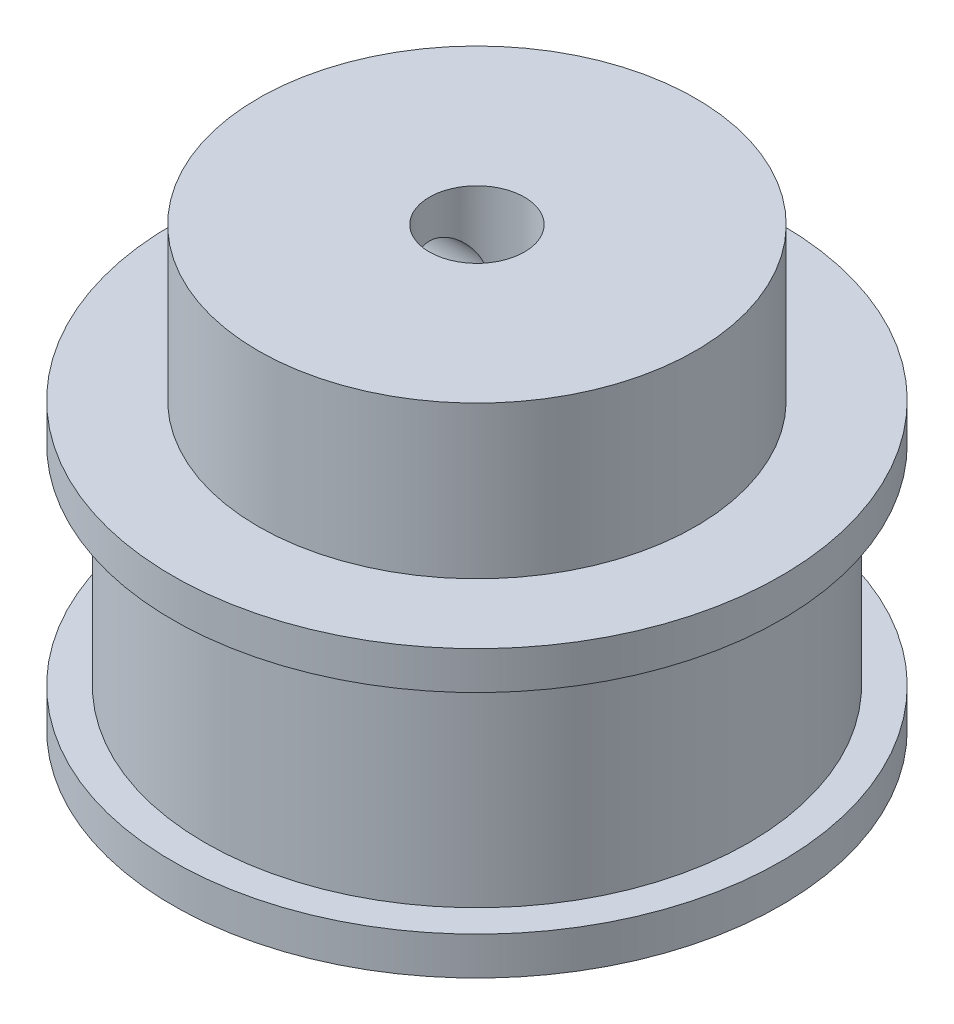
ISO-10303-21;
HEADER;
FILE_DESCRIPTION(('STEP AP214'),'2;1');
FILE_NAME('part.step','',(''),(''),'','','');
FILE_SCHEMA(('AUTOMOTIVE_DESIGN { 1 0 10303 214 1 1 1 1 }'));
ENDSEC;
DATA;
#1=APPLICATION_CONTEXT('core data for automotive mechanical design processes');
#2=APPLICATION_PROTOCOL_DEFINITION('international standard','automotive_design',2000,#1);
#3=PRODUCT_CONTEXT('',#1,'mechanical');
#4=PRODUCT('Part','Part','',(#3));
#5=PRODUCT_RELATED_PRODUCT_CATEGORY('part','',(#4));
#6=PRODUCT_DEFINITION_FORMATION('','',#4);
#7=PRODUCT_DEFINITION_CONTEXT('part definition',#1,'design');
#8=PRODUCT_DEFINITION('design','',#6,#7);
#9=PRODUCT_DEFINITION_SHAPE('','',#8);
#10=(LENGTH_UNIT() NAMED_UNIT(*) SI_UNIT(.MILLI.,.METRE.));
#11=(NAMED_UNIT(*) PLANE_ANGLE_UNIT() SI_UNIT($,.RADIAN.));
#12=(NAMED_UNIT(*) SI_UNIT($,.STERADIAN.) SOLID_ANGLE_UNIT());
#13=UNCERTAINTY_MEASURE_WITH_UNIT(LENGTH_MEASURE(1.E-05),#10,'distance_accuracy_value','');
#14=(GEOMETRIC_REPRESENTATION_CONTEXT(3) GLOBAL_UNCERTAINTY_ASSIGNED_CONTEXT((#13)) GLOBAL_UNIT_ASSIGNED_CONTEXT((#10,
#11,#12)) REPRESENTATION_CONTEXT('',''));
#15=CARTESIAN_POINT('',(0.,0.,0.));
#16=DIRECTION('',(0.,0.,1.));
#17=DIRECTION('',(1.,0.,0.));
#18=AXIS2_PLACEMENT_3D('',#15,#16,#17);
#19=CARTESIAN_POINT('',(0.,8.,0.));
#20=DIRECTION('',(0.,1.,0.));
#21=DIRECTION('',(0.,0.,1.));
#22=AXIS2_PLACEMENT_3D('',#19,#20,#21);
#23=PLANE('',#22);
#24=CARTESIAN_POINT('',(0.,8.,0.));
#25=DIRECTION('',(0.,1.,0.));
#26=DIRECTION('',(0.,0.,1.));
#27=AXIS2_PLACEMENT_3D('',#24,#25,#26);
#28=CIRCLE('',#27,11.5);
#29=CARTESIAN_POINT('',(0.,8.,11.5));
#30=VERTEX_POINT('',#29);
#31=EDGE_CURVE('E51',#30,#30,#28,.T.);
#32=ORIENTED_EDGE('',*,*,#31,.T.);
#33=EDGE_LOOP('',(#32));
#34=FACE_BOUND('',#33,.T.);
#35=CARTESIAN_POINT('',(0.,8.,0.));
#36=DIRECTION('',(0.,1.,0.));
#37=DIRECTION('',(0.,0.,1.));
#38=AXIS2_PLACEMENT_3D('',#35,#36,#37);
#39=CIRCLE('',#38,2.5);
#40=CARTESIAN_POINT('',(0.,8.,2.5));
#41=VERTEX_POINT('',#40);
#42=EDGE_CURVE('E56',#41,#41,#39,.T.);
#43=ORIENTED_EDGE('',*,*,#42,.F.);
#44=EDGE_LOOP('',(#43));
#45=FACE_BOUND('',#44,.T.);
#46=ADVANCED_FACE('F37',(#34,#45),#23,.T.);
#47=CARTESIAN_POINT('',(0.,8.,0.));
#48=DIRECTION('',(0.,-1.,0.));
#49=DIRECTION('',(0.,0.,-1.));
#50=AXIS2_PLACEMENT_3D('',#47,#48,#49);
#51=CYLINDRICAL_SURFACE('',#50,11.5);
#52=CARTESIAN_POINT('',(-11.3247516529061,4.,-2.));
#53=CARTESIAN_POINT('',(-11.3247537205819,4.11142562099397,-1.99999558597401));
#54=CARTESIAN_POINT('',(-11.3264139827802,4.22291028889795,-1.99065669316545));
#55=CARTESIAN_POINT('',(-11.3328688551358,4.44274636740357,-1.95356708939089));
#56=CARTESIAN_POINT('',(-11.33766627807,4.55109487500114,-1.92579985524801));
#57=CARTESIAN_POINT('',(-11.3498360600537,4.76144554007058,-1.85272335803516));
#58=CARTESIAN_POINT('',(-11.3572061841861,4.86345311562085,-1.80742931688541));
#59=CARTESIAN_POINT('',(-11.3736883000087,5.05841161601283,-1.70062369764682));
#60=CARTESIAN_POINT('',(-11.3828001159033,5.15136345345571,-1.63911375605189));
#61=CARTESIAN_POINT('',(-11.4018480981189,5.32657826774763,-1.50091903774627));
#62=CARTESIAN_POINT('',(-11.4117913392663,5.40873004959007,-1.42409423398176));
#63=CARTESIAN_POINT('',(-11.4313190954722,5.55904594067203,-1.25775320234599));
#64=CARTESIAN_POINT('',(-11.4409035884926,5.62720919173609,-1.16823619639638));
#65=CARTESIAN_POINT('',(-11.4587091304249,5.74803346449827,-0.978327923917849));
#66=CARTESIAN_POINT('',(-11.4669208839961,5.80059053334745,-0.877869574063397));
#67=CARTESIAN_POINT('',(-11.480976816383,5.88804185044037,-0.669383197014698));
#68=CARTESIAN_POINT('',(-11.4868211627025,5.92293734835569,-0.561355706002592));
#69=CARTESIAN_POINT('',(-11.4954338269441,5.97373358564221,-0.341947633116551));
#70=CARTESIAN_POINT('',(-11.498232417599,5.98982138209595,-0.230611565546449));
#71=CARTESIAN_POINT('',(-11.5005423674052,6.0031276046644,-0.00678765390913067));
#72=CARTESIAN_POINT('',(-11.5000539689352,6.00034742208196,0.105700104622982));
#73=CARTESIAN_POINT('',(-11.4958688307837,5.97614167415024,0.327354034819944));
#74=CARTESIAN_POINT('',(-11.4922067377841,5.95491745239668,0.436542942284606));
#75=CARTESIAN_POINT('',(-11.4821243806992,5.89474361578169,0.649785580879481));
#76=CARTESIAN_POINT('',(-11.4757040268738,5.85579342420229,0.753839144808165));
#77=CARTESIAN_POINT('',(-11.4607678978163,5.76107598266205,0.954451229044581));
#78=CARTESIAN_POINT('',(-11.4522419271588,5.70522660110795,1.0509701815211));
#79=CARTESIAN_POINT('',(-11.4340403719153,5.57835642164983,1.2333420854561));
#80=CARTESIAN_POINT('',(-11.4243646862781,5.50733428973887,1.31919409801365));
#81=CARTESIAN_POINT('',(-11.4047875182908,5.35102031419883,1.47898585978921));
#82=CARTESIAN_POINT('',(-11.3948847414525,5.26555242815413,1.55275334293455));
#83=CARTESIAN_POINT('',(-11.3760925794432,5.08336394754947,1.68492975767179));
#84=CARTESIAN_POINT('',(-11.3672032053044,4.9866432305097,1.74333852207136));
#85=CARTESIAN_POINT('',(-11.3514432398975,4.78448530281939,1.84317841441167));
#86=CARTESIAN_POINT('',(-11.3445752885049,4.67903692238307,1.88458736906755));
#87=CARTESIAN_POINT('',(-11.3336782857076,4.46253442958012,1.94905513499079));
#88=CARTESIAN_POINT('',(-11.3296489606111,4.35148085875615,1.97211571538197));
#89=CARTESIAN_POINT('',(-11.3249387995064,4.1284657553841,1.99898657304447));
#90=CARTESIAN_POINT('',(-11.324215139466,4.01653476471456,2.00304306114625));
#91=CARTESIAN_POINT('',(-11.3260840021193,3.79359378079224,1.99244800139487));
#92=CARTESIAN_POINT('',(-11.3286763848073,3.68258374885512,1.97779724337415));
#93=CARTESIAN_POINT('',(-11.3368455622917,3.46542707127959,1.93041398591612));
#94=CARTESIAN_POINT('',(-11.3424014571722,3.35925195086902,1.89780806222847));
#95=CARTESIAN_POINT('',(-11.3558539570509,3.15387252127274,1.81557330317427));
#96=CARTESIAN_POINT('',(-11.363750713151,3.05466866259123,1.76594336888088));
#97=CARTESIAN_POINT('',(-11.3810940116527,2.86495572289289,1.65049315592603));
#98=CARTESIAN_POINT('',(-11.3905552702484,2.77454357147513,1.58451584938643));
#99=CARTESIAN_POINT('',(-11.4099190477513,2.60598527538341,1.43845799736366));
#100=CARTESIAN_POINT('',(-11.4198216005248,2.52784007420264,1.35837636807286));
#101=CARTESIAN_POINT('',(-11.4390883837432,2.38512791990843,1.18528928743518));
#102=CARTESIAN_POINT('',(-11.4484452043369,2.32072563392699,1.09214711474509));
#103=CARTESIAN_POINT('',(-11.465445502968,2.2084837729025,0.896222231846071));
#104=CARTESIAN_POINT('',(-11.4730890401359,2.16064362621938,0.793439854523201));
#105=CARTESIAN_POINT('',(-11.485769460486,2.08313705089823,0.5816298491926));
#106=CARTESIAN_POINT('',(-11.4908184295855,2.05338623817561,0.472633854253146));
#107=CARTESIAN_POINT('',(-11.4977920861693,2.01263188044337,0.251097143715065));
#108=CARTESIAN_POINT('',(-11.4997170545972,2.00162664962648,0.138556747794838));
#109=CARTESIAN_POINT('',(-11.5002213060365,1.99872778648706,-0.0852882866706104));
#110=CARTESIAN_POINT('',(-11.4988443397254,2.00658423824963,-0.196589668647048));
#111=CARTESIAN_POINT('',(-11.4929892838617,2.04064289017588,-0.416261557793871));
#112=CARTESIAN_POINT('',(-11.4885112155646,2.06684496459532,-0.524632085047582));
#113=CARTESIAN_POINT('',(-11.4769558245729,2.13675194878704,-0.735258236003959));
#114=CARTESIAN_POINT('',(-11.4698819271422,2.1804338003819,-0.83752171229288));
#115=CARTESIAN_POINT('',(-11.4539049096061,2.28403187912627,-1.03330619770982));
#116=CARTESIAN_POINT('',(-11.4450016904966,2.34394898499488,-1.12682673326512));
#117=CARTESIAN_POINT('',(-11.4262120716441,2.47919418141623,-1.30372516904164));
#118=CARTESIAN_POINT('',(-11.4163148310422,2.55470449106434,-1.38696262031807));
#119=CARTESIAN_POINT('',(-11.3967254316858,2.71861143824069,-1.53967264545867));
#120=CARTESIAN_POINT('',(-11.3870333215344,2.80701109144597,-1.60914198904573));
#121=CARTESIAN_POINT('',(-11.3688697482252,2.99500690179009,-1.73284483048114));
#122=CARTESIAN_POINT('',(-11.3604083735618,3.09468485436729,-1.78695552656204));
#123=CARTESIAN_POINT('',(-11.3457841644966,3.30182531056561,-1.87757996743765));
#124=CARTESIAN_POINT('',(-11.3396190772932,3.40928006036469,-1.91411096934413));
#125=CARTESIAN_POINT('',(-11.3316255929774,3.59760066737018,-1.96077459333842));
#126=CARTESIAN_POINT('',(-11.3290625197338,3.6773381676111,-1.97545999139583));
#127=CARTESIAN_POINT('',(-11.3256248158752,3.83804006250487,-1.9950741968675));
#128=CARTESIAN_POINT('',(-11.3247501499073,3.91900443143305,-2.00000320856677));
#129=CARTESIAN_POINT('',(-11.3247516529061,4.,-2.));
#130=B_SPLINE_CURVE_WITH_KNOTS('',3,(#52,#53,#54,#55,#56,#57,#58,#59,#60,#61,#62,#63,#64,#65,
#66,#67,#68,#69,#70,#71,#72,#73,#74,#75,#76,#77,#78,#79,#80,#81,#82,#83,#84,#85,#86,#87,#88,#89,
#90,#91,#92,#93,#94,#95,#96,#97,#98,#99,#100,#101,#102,#103,#104,#105,#106,#107,#108,#109,#110,
#111,#112,#113,#114,#115,#116,#117,#118,#119,#120,#121,#122,#123,#124,#125,#126,#127,#128,#129),
.UNSPECIFIED.,.T.,.F.,(4,2,2,2,2,2,2,2,2,2,2,2,2,2,2,2,2,2,2,2,2,2,2,2,2,2,2,2,2,2,2,2,2,2,2,2,
2,2,4),(0.,0.333980606139346,0.668261070490513,1.00225186364184,1.3362089636408,
1.67337246687656,2.01055664841041,2.3499388730908,2.68929708090209,3.02525059520396,
3.36117933695323,3.69348634862079,4.02580417273624,4.35976376520554,4.69375273190751,
5.03215189209426,5.37055473588284,5.70939757540995,6.04820774023801,6.3826160228167,
6.71701018692082,7.0490766545066,7.38116456154372,7.71657525808512,8.05201173958651,
8.39126606754903,8.73050868502527,9.0681563952013,9.40577373880741,9.73894241964221,
10.0721088169003,10.4048371640595,10.7375835234514,11.0744639612086,11.4114233446192,
11.7510055527796,12.090253726506,12.3330301658018,12.5758015216469),.UNSPECIFIED.);
#131=CARTESIAN_POINT('',(-11.3247516529061,4.,-2.));
#132=VERTEX_POINT('',#131);
#133=EDGE_CURVE('E118',#132,#132,#130,.T.);
#134=ORIENTED_EDGE('',*,*,#133,.T.);
#135=EDGE_LOOP('',(#134));
#136=FACE_BOUND('',#135,.T.);
#137=ORIENTED_EDGE('',*,*,#31,.F.);
#138=EDGE_LOOP('',(#137));
#139=FACE_BOUND('',#138,.T.);
#140=CARTESIAN_POINT('',(0.,0.,0.));
#141=DIRECTION('',(0.,1.,0.));
#142=DIRECTION('',(0.,0.,1.));
#143=AXIS2_PLACEMENT_3D('',#140,#141,#142);
#144=CIRCLE('',#143,11.5);
#145=CARTESIAN_POINT('',(0.,0.,11.5));
#146=VERTEX_POINT('',#145);
#147=EDGE_CURVE('E65',#146,#146,#144,.T.);
#148=ORIENTED_EDGE('',*,*,#147,.T.);
#149=EDGE_LOOP('',(#148));
#150=FACE_BOUND('',#149,.T.);
#151=ADVANCED_FACE('F39',(#136,#139,#150),#51,.T.);
#152=CARTESIAN_POINT('',(0.,8.,0.));
#153=DIRECTION('',(0.,-1.,0.));
#154=DIRECTION('',(0.,0.,-1.));
#155=AXIS2_PLACEMENT_3D('',#152,#153,#154);
#156=CYLINDRICAL_SURFACE('',#155,2.5);
#157=CARTESIAN_POINT('',(-1.5,4.,-2.));
#158=CARTESIAN_POINT('',(-1.5000227575991,4.07508101738856,-1.9999899563842));
#159=CARTESIAN_POINT('',(-1.50575588676017,4.15027892609362,-1.99572243014959));
#160=CARTESIAN_POINT('',(-1.52759797098302,4.29831452942962,-1.97904350434638));
#161=CARTESIAN_POINT('',(-1.54374252679463,4.37114322181213,-1.96660415938922));
#162=CARTESIAN_POINT('',(-1.59078313764401,4.53760541950855,-1.9288828901246));
#163=CARTESIAN_POINT('',(-1.62485949442394,4.62964250709955,-1.90063587852784));
#164=CARTESIAN_POINT('',(-1.70094533012843,4.80596814016129,-1.83286412912234));
#165=CARTESIAN_POINT('',(-1.74297705283045,4.89023394966714,-1.79330760683741));
#166=CARTESIAN_POINT('',(-1.84624966659378,5.08033965678051,-1.68777756612173));
#167=CARTESIAN_POINT('',(-1.90894188114929,5.18296657412729,-1.61742363711761));
#168=CARTESIAN_POINT('',(-2.03287996747903,5.37397683521222,-1.4586193506474));
#169=CARTESIAN_POINT('',(-2.0941269976447,5.4623719421139,-1.37018407682201));
#170=CARTESIAN_POINT('',(-2.1979067439451,5.60710491957747,-1.19476026278806));
#171=CARTESIAN_POINT('',(-2.24174680788007,5.66632628268407,-1.11093376146689));
#172=CARTESIAN_POINT('',(-2.32165152523267,5.7723659599663,-0.932444755507564));
#173=CARTESIAN_POINT('',(-2.35772824500368,5.81920354820088,-0.837799422094951));
#174=CARTESIAN_POINT('',(-2.41415644696378,5.89171296058066,-0.655317082222549));
#175=CARTESIAN_POINT('',(-2.43610736091393,5.91958256457612,-0.568853585755695));
#176=CARTESIAN_POINT('',(-2.47085912284979,5.963498695254,-0.391188052921991));
#177=CARTESIAN_POINT('',(-2.48366497483986,5.97955168791005,-0.299988637312623));
#178=CARTESIAN_POINT('',(-2.49907968883617,5.99885809329014,-0.115048335136528));
#179=CARTESIAN_POINT('',(-2.50165324772141,6.00206719268864,-0.0212997713727012));
#180=CARTESIAN_POINT('',(-2.49626936144757,5.99533576512782,0.165416366428141));
#181=CARTESIAN_POINT('',(-2.48831142893578,5.98539462963146,0.258383904122233));
#182=CARTESIAN_POINT('',(-2.4632836571348,5.95393201368696,0.435683568436098));
#183=CARTESIAN_POINT('',(-2.44673404857181,5.93307118304393,0.520210188917499));
#184=CARTESIAN_POINT('',(-2.40604493660584,5.88130476574777,0.684171862172426));
#185=CARTESIAN_POINT('',(-2.38190351809567,5.85039664450243,0.763605624129769));
#186=CARTESIAN_POINT('',(-2.32486221996811,5.77639930141148,0.923527318234433));
#187=CARTESIAN_POINT('',(-2.29134265660255,5.7324234839853,1.00337969293305));
#188=CARTESIAN_POINT('',(-2.21894043646479,5.6354621404083,1.15470891362336));
#189=CARTESIAN_POINT('',(-2.18005477975511,5.58247157063692,1.22618103296473));
#190=CARTESIAN_POINT('',(-2.09053510980241,5.45693813120116,1.37426521356107));
#191=CARTESIAN_POINT('',(-2.03913144290366,5.38261638579514,1.44890108738507));
#192=CARTESIAN_POINT('',(-1.9349237792571,5.22374409634926,1.58538384993671));
#193=CARTESIAN_POINT('',(-1.88211814269102,5.13918112132573,1.6472149443604));
#194=CARTESIAN_POINT('',(-1.78441317626436,4.96877980418208,1.75228528490804));
#195=CARTESIAN_POINT('',(-1.73924224553799,4.8838490594863,1.79674173995946));
#196=CARTESIAN_POINT('',(-1.65582105773209,4.70563353366548,1.87389106987978));
#197=CARTESIAN_POINT('',(-1.61755576516689,4.61236757966236,1.90660965872838));
#198=CARTESIAN_POINT('',(-1.56393805143324,4.44720839597225,1.95062199735974));
#199=CARTESIAN_POINT('',(-1.54515601955456,4.3773871691021,1.96540293714784));
#200=CARTESIAN_POINT('',(-1.51667304681101,4.23481979404585,1.98746978122375));
#201=CARTESIAN_POINT('',(-1.50695186390373,4.16208054608934,1.99477239579985));
#202=CARTESIAN_POINT('',(-1.49827790293909,4.01513662207263,2.0012999442642));
#203=CARTESIAN_POINT('',(-1.49938753445573,3.94092591494256,2.00047806264257));
#204=CARTESIAN_POINT('',(-1.51230456185752,3.79395267496259,1.99072610261057));
#205=CARTESIAN_POINT('',(-1.52412705251965,3.72119233361255,1.98178458332099));
#206=CARTESIAN_POINT('',(-1.56051508430773,3.56093679733818,1.95331430449204));
#207=CARTESIAN_POINT('',(-1.58755721486228,3.47440173186917,1.9316709289088));
#208=CARTESIAN_POINT('',(-1.65022809339808,3.30770913391453,1.87841388450525));
#209=CARTESIAN_POINT('',(-1.6858823654909,3.22757151909691,1.84677049067316));
#210=CARTESIAN_POINT('',(-1.77903249993889,3.03847107065071,1.75807608919816));
#211=CARTESIAN_POINT('',(-1.83905564347523,2.93310466567485,1.69602510944931));
#212=CARTESIAN_POINT('',(-1.96026853157683,2.73561585075799,1.55438039564658));
#213=CARTESIAN_POINT('',(-2.02145957104429,2.64350924031655,1.47476601547362));
#214=CARTESIAN_POINT('',(-2.13993299259157,2.47253719265497,1.29702304107542));
#215=CARTESIAN_POINT('',(-2.1971478825966,2.39387737088694,1.19864860522964));
#216=CARTESIAN_POINT('',(-2.30083046289374,2.25473347255582,0.984970277741329));
#217=CARTESIAN_POINT('',(-2.3473329244064,2.19419039432937,0.869723203455201));
#218=CARTESIAN_POINT('',(-2.41163161860482,2.11150941253312,0.664531994140983));
#219=CARTESIAN_POINT('',(-2.43384921549885,2.08328262302589,0.578408265123345));
#220=CARTESIAN_POINT('',(-2.46921550391513,2.03856786503603,0.401365381235642));
#221=CARTESIAN_POINT('',(-2.48237111815072,2.02207093545939,0.31044994417907));
#222=CARTESIAN_POINT('',(-2.49854699723994,2.0018071758953,0.125961358052314));
#223=CARTESIAN_POINT('',(-2.50153028039159,1.99808679494169,0.0323797561454596));
#224=CARTESIAN_POINT('',(-2.4969871999336,2.00376650926522,-0.154129494971544));
#225=CARTESIAN_POINT('',(-2.48946009629711,2.01316752840829,-0.24705709767118));
#226=CARTESIAN_POINT('',(-2.46524008405095,2.04360354709121,-0.424484983307837));
#227=CARTESIAN_POINT('',(-2.44905900306101,2.06398933140284,-0.509170159101608));
#228=CARTESIAN_POINT('',(-2.4090520196301,2.11485342131346,-0.673520542356739));
#229=CARTESIAN_POINT('',(-2.3852241372675,2.14533434082602,-0.753184443303521));
#230=CARTESIAN_POINT('',(-2.32886203207214,2.21837454439256,-0.913383591851863));
#231=CARTESIAN_POINT('',(-2.29572397002092,2.26179384211099,-0.993310088153967));
#232=CARTESIAN_POINT('',(-2.22403396009593,2.35764233709463,-1.14486396126305));
#233=CARTESIAN_POINT('',(-2.18547913977516,2.41007631806849,-1.21648689776308));
#234=CARTESIAN_POINT('',(-2.0966685242987,2.53429621300368,-1.36488223995397));
#235=CARTESIAN_POINT('',(-2.04563299169992,2.60784641331541,-1.4397080379364));
#236=CARTESIAN_POINT('',(-1.9420131292006,2.76511692552339,-1.5766935307999));
#237=CARTESIAN_POINT('',(-1.88942694411834,2.84884982760533,-1.63883728583053));
#238=CARTESIAN_POINT('',(-1.79109125321811,3.01895754452958,-1.7455126136634));
#239=CARTESIAN_POINT('',(-1.74513263017548,3.10457252121606,-1.79106140064659));
#240=CARTESIAN_POINT('',(-1.66007449903139,3.28439188825136,-1.87016304685231));
#241=CARTESIAN_POINT('',(-1.6209622208173,3.37857977803773,-1.90373836359645));
#242=CARTESIAN_POINT('',(-1.56580101941138,3.54613932675266,-1.94914139922438));
#243=CARTESIAN_POINT('',(-1.54635220628734,3.61741954440719,-1.96446470848963));
#244=CARTESIAN_POINT('',(-1.51695472225641,3.76302427097086,-1.98726282623961));
#245=CARTESIAN_POINT('',(-1.50696990066825,3.83733605527794,-1.99476751139893));
#246=CARTESIAN_POINT('',(-1.50085460132402,3.94132521434233,-1.99935742227831));
#247=CARTESIAN_POINT('',(-1.49999110491774,3.97065367824346,-2.00000392566845));
#248=CARTESIAN_POINT('',(-1.5,4.,-2.));
#249=B_SPLINE_CURVE_WITH_KNOTS('',3,(#157,#158,#159,#160,#161,#162,#163,#164,#165,#166,#167,
#168,#169,#170,#171,#172,#173,#174,#175,#176,#177,#178,#179,#180,#181,#182,#183,#184,#185,#186,
#187,#188,#189,#190,#191,#192,#193,#194,#195,#196,#197,#198,#199,#200,#201,#202,#203,#204,#205,
#206,#207,#208,#209,#210,#211,#212,#213,#214,#215,#216,#217,#218,#219,#220,#221,#222,#223,#224,
#225,#226,#227,#228,#229,#230,#231,#232,#233,#234,#235,#236,#237,#238,#239,#240,#241,#242,#243,
#244,#245,#246,#247,#248),.UNSPECIFIED.,.T.,.F.,(4,2,2,2,2,2,2,2,2,2,2,2,2,2,2,2,2,2,2,2,2,2,2,
2,2,2,2,2,2,2,2,2,2,2,2,2,2,2,2,2,2,2,2,2,2,4),(0.,0.225140818813291,0.451055593895016,
0.75571438466088,1.06123795594964,1.47720804611674,1.8928325353688,2.22639303179097,
2.55943127851024,2.83862094435178,3.11765772560939,3.39765639927928,3.67766803055209,
3.94241917501297,4.20723715914625,4.49756510688428,4.78805602626152,5.13841226546404,
5.48919811771067,5.80619193384967,6.12248701337037,6.34307726284837,6.56317352160417,
6.78453876949455,7.00621641426758,7.28428560377194,7.56318925297413,7.96975811975666,
8.3768074872857,8.78961174948152,9.20105660259843,9.4798592761315,9.75844872724252,
10.0380499218877,10.3176708039936,10.5823344198312,10.8470666181456,11.1364335884202,
11.4259545900794,11.7747351905783,12.1239515037794,12.4449574092071,12.7653580273015,
12.9909138326702,13.2156045429056,13.3036035490356),.UNSPECIFIED.);
#250=CARTESIAN_POINT('',(-1.5,4.,-2.));
#251=VERTEX_POINT('',#250);
#252=EDGE_CURVE('E42',#251,#251,#249,.T.);
#253=ORIENTED_EDGE('',*,*,#252,.F.);
#254=EDGE_LOOP('',(#253));
#255=FACE_BOUND('',#254,.T.);
#256=ORIENTED_EDGE('',*,*,#42,.T.);
#257=EDGE_LOOP('',(#256));
#258=FACE_BOUND('',#257,.T.);
#259=CARTESIAN_POINT('',(0.,0.,0.));
#260=DIRECTION('',(0.,1.,0.));
#261=DIRECTION('',(0.,0.,1.));
#262=AXIS2_PLACEMENT_3D('',#259,#260,#261);
#263=CIRCLE('',#262,2.5);
#264=CARTESIAN_POINT('',(0.,0.,2.5));
#265=VERTEX_POINT('',#264);
#266=EDGE_CURVE('E71',#265,#265,#263,.T.);
#267=ORIENTED_EDGE('',*,*,#266,.F.);
#268=EDGE_LOOP('',(#267));
#269=FACE_BOUND('',#268,.T.);
#270=ADVANCED_FACE('F96',(#255,#258,#269),#156,.F.);
#271=CARTESIAN_POINT('',(0.,0.,0.));
#272=DIRECTION('',(0.,-1.,0.));
#273=DIRECTION('',(0.,0.,-1.));
#274=AXIS2_PLACEMENT_3D('',#271,#272,#273);
#275=PLANE('',#274);
#276=ORIENTED_EDGE('',*,*,#266,.T.);
#277=EDGE_LOOP('',(#276));
#278=FACE_BOUND('',#277,.T.);
#279=ADVANCED_FACE('F83',(#278),#275,.F.);
#280=CARTESIAN_POINT('',(0.,-2.,0.));
#281=DIRECTION('',(0.,1.,0.));
#282=DIRECTION('',(0.,0.,1.));
#283=AXIS2_PLACEMENT_3D('',#280,#281,#282);
#284=CYLINDRICAL_SURFACE('',#283,16.);
#285=CARTESIAN_POINT('',(0.,-2.,0.));
#286=DIRECTION('',(0.,-1.,0.));
#287=DIRECTION('',(0.,0.,-1.));
#288=AXIS2_PLACEMENT_3D('',#285,#286,#287);
#289=CIRCLE('',#288,16.);
#290=CARTESIAN_POINT('',(0.,-2.,-16.));
#291=VERTEX_POINT('',#290);
#292=EDGE_CURVE('E62',#291,#291,#289,.T.);
#293=ORIENTED_EDGE('',*,*,#292,.F.);
#294=EDGE_LOOP('',(#293));
#295=FACE_BOUND('',#294,.T.);
#296=CARTESIAN_POINT('',(0.,0.,0.));
#297=DIRECTION('',(0.,-1.,0.));
#298=DIRECTION('',(0.,0.,-1.));
#299=AXIS2_PLACEMENT_3D('',#296,#297,#298);
#300=CIRCLE('',#299,16.);
#301=CARTESIAN_POINT('',(0.,0.,-16.));
#302=VERTEX_POINT('',#301);
#303=EDGE_CURVE('E66',#302,#302,#300,.T.);
#304=ORIENTED_EDGE('',*,*,#303,.T.);
#305=EDGE_LOOP('',(#304));
#306=FACE_BOUND('',#305,.T.);
#307=ADVANCED_FACE('F86',(#295,#306),#284,.T.);
#308=CARTESIAN_POINT('',(0.,-2.,0.));
#309=DIRECTION('',(0.,-1.,0.));
#310=DIRECTION('',(0.,0.,-1.));
#311=AXIS2_PLACEMENT_3D('',#308,#309,#310);
#312=PLANE('',#311);
#313=CARTESIAN_POINT('',(0.,-2.,0.));
#314=DIRECTION('',(0.,-1.,0.));
#315=DIRECTION('',(0.,0.,-1.));
#316=AXIS2_PLACEMENT_3D('',#313,#314,#315);
#317=CIRCLE('',#316,14.3);
#318=CARTESIAN_POINT('',(0.,-2.,-14.3));
#319=VERTEX_POINT('',#318);
#320=EDGE_CURVE('E10',#319,#319,#317,.T.);
#321=ORIENTED_EDGE('',*,*,#320,.F.);
#322=EDGE_LOOP('',(#321));
#323=FACE_BOUND('',#322,.T.);
#324=ORIENTED_EDGE('',*,*,#292,.T.);
#325=EDGE_LOOP('',(#324));
#326=FACE_BOUND('',#325,.T.);
#327=ADVANCED_FACE('F81',(#323,#326),#312,.T.);
#328=ORIENTED_EDGE('',*,*,#147,.F.);
#329=EDGE_LOOP('',(#328));
#330=FACE_BOUND('',#329,.T.);
#331=ORIENTED_EDGE('',*,*,#303,.F.);
#332=EDGE_LOOP('',(#331));
#333=FACE_BOUND('',#332,.T.);
#334=ADVANCED_FACE('F77',(#330,#333),#275,.F.);
#335=CARTESIAN_POINT('',(0.,-13.,0.));
#336=DIRECTION('',(0.,1.,0.));
#337=DIRECTION('',(0.,0.,1.));
#338=AXIS2_PLACEMENT_3D('',#335,#336,#337);
#339=CYLINDRICAL_SURFACE('',#338,14.3);
#340=CARTESIAN_POINT('',(0.,-13.,0.));
#341=DIRECTION('',(0.,-1.,0.));
#342=DIRECTION('',(0.,0.,-1.));
#343=AXIS2_PLACEMENT_3D('',#340,#341,#342);
#344=CIRCLE('',#343,14.3);
#345=CARTESIAN_POINT('',(0.,-13.,-14.3));
#346=VERTEX_POINT('',#345);
#347=EDGE_CURVE('E60',#346,#346,#344,.T.);
#348=ORIENTED_EDGE('',*,*,#347,.F.);
#349=EDGE_LOOP('',(#348));
#350=FACE_BOUND('',#349,.T.);
#351=ORIENTED_EDGE('',*,*,#320,.T.);
#352=EDGE_LOOP('',(#351));
#353=FACE_BOUND('',#352,.T.);
#354=ADVANCED_FACE('F80',(#350,#353),#339,.T.);
#355=CARTESIAN_POINT('',(0.,-15.,0.));
#356=DIRECTION('',(0.,1.,0.));
#357=DIRECTION('',(0.,0.,1.));
#358=AXIS2_PLACEMENT_3D('',#355,#356,#357);
#359=CYLINDRICAL_SURFACE('',#358,16.);
#360=CARTESIAN_POINT('',(0.,-15.,0.));
#361=DIRECTION('',(0.,-1.,0.));
#362=DIRECTION('',(0.,0.,-1.));
#363=AXIS2_PLACEMENT_3D('',#360,#361,#362);
#364=CIRCLE('',#363,16.);
#365=CARTESIAN_POINT('',(0.,-15.,-16.));
#366=VERTEX_POINT('',#365);
#367=EDGE_CURVE('E124',#366,#366,#364,.T.);
#368=ORIENTED_EDGE('',*,*,#367,.F.);
#369=EDGE_LOOP('',(#368));
#370=FACE_BOUND('',#369,.T.);
#371=CARTESIAN_POINT('',(0.,-13.,0.));
#372=DIRECTION('',(0.,-1.,0.));
#373=DIRECTION('',(0.,0.,-1.));
#374=AXIS2_PLACEMENT_3D('',#371,#372,#373);
#375=CIRCLE('',#374,16.);
#376=CARTESIAN_POINT('',(0.,-13.,-16.));
#377=VERTEX_POINT('',#376);
#378=EDGE_CURVE('E120',#377,#377,#375,.T.);
#379=ORIENTED_EDGE('',*,*,#378,.T.);
#380=EDGE_LOOP('',(#379));
#381=FACE_BOUND('',#380,.T.);
#382=ADVANCED_FACE('F138',(#370,#381),#359,.T.);
#383=CARTESIAN_POINT('',(0.,-15.,0.));
#384=DIRECTION('',(0.,-1.,0.));
#385=DIRECTION('',(0.,0.,-1.));
#386=AXIS2_PLACEMENT_3D('',#383,#384,#385);
#387=PLANE('',#386);
#388=ORIENTED_EDGE('',*,*,#367,.T.);
#389=EDGE_LOOP('',(#388));
#390=FACE_BOUND('',#389,.T.);
#391=ADVANCED_FACE('F134',(#390),#387,.T.);
#392=CARTESIAN_POINT('',(0.,-13.,0.));
#393=DIRECTION('',(0.,-1.,0.));
#394=DIRECTION('',(0.,0.,-1.));
#395=AXIS2_PLACEMENT_3D('',#392,#393,#394);
#396=PLANE('',#395);
#397=ORIENTED_EDGE('',*,*,#347,.T.);
#398=EDGE_LOOP('',(#397));
#399=FACE_BOUND('',#398,.T.);
#400=ORIENTED_EDGE('',*,*,#378,.F.);
#401=EDGE_LOOP('',(#400));
#402=FACE_BOUND('',#401,.T.);
#403=ADVANCED_FACE('F133',(#399,#402),#396,.F.);
#404=CARTESIAN_POINT('',(-19.,4.,0.));
#405=DIRECTION('',(1.,0.,0.));
#406=DIRECTION('',(0.,0.,-1.));
#407=AXIS2_PLACEMENT_3D('',#404,#405,#406);
#408=CYLINDRICAL_SURFACE('',#407,2.);
#409=ORIENTED_EDGE('',*,*,#252,.T.);
#410=EDGE_LOOP('',(#409));
#411=FACE_BOUND('',#410,.T.);
#412=ORIENTED_EDGE('',*,*,#133,.F.);
#413=EDGE_LOOP('',(#412));
#414=FACE_BOUND('',#413,.T.);
#415=ADVANCED_FACE('F129',(#411,#414),#408,.F.);
#416=CLOSED_SHELL('',(#46,#151,#270,#279,#307,#327,#334,#354,#382,#391,#403,#415));
#417=MANIFOLD_SOLID_BREP('B2',#416);
#418=ADVANCED_BREP_SHAPE_REPRESENTATION('',(#18,#417),#14);
#419=SHAPE_DEFINITION_REPRESENTATION(#9,#418);
ENDSEC;
END-ISO-10303-21;
